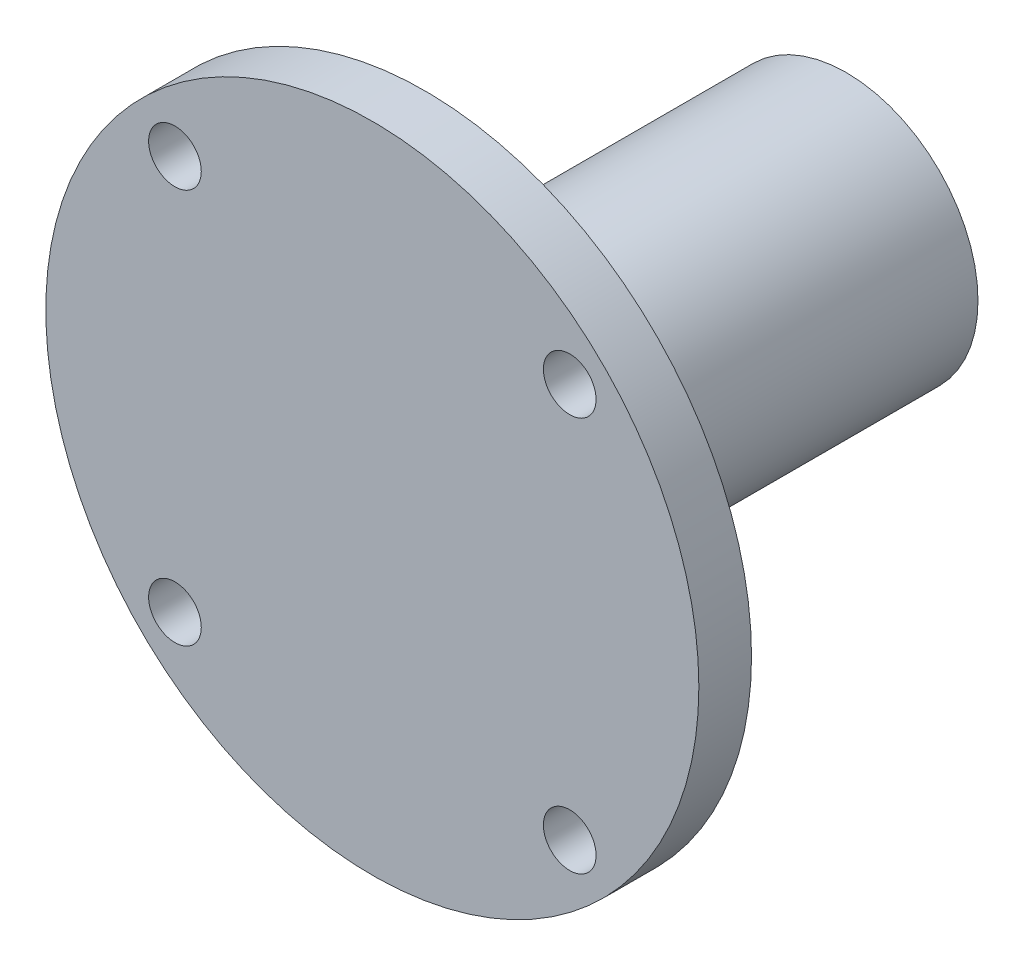
ISO-10303-21;
HEADER;
FILE_DESCRIPTION(('STEP AP214'),'2;1');
FILE_NAME('part.step','',(''),(''),'','','');
FILE_SCHEMA(('AUTOMOTIVE_DESIGN { 1 0 10303 214 1 1 1 1 }'));
ENDSEC;
DATA;
#1=APPLICATION_CONTEXT('core data for automotive mechanical design processes');
#2=APPLICATION_PROTOCOL_DEFINITION('international standard','automotive_design',2000,#1);
#3=PRODUCT_CONTEXT('',#1,'mechanical');
#4=PRODUCT('Part','Part','',(#3));
#5=PRODUCT_RELATED_PRODUCT_CATEGORY('part','',(#4));
#6=PRODUCT_DEFINITION_FORMATION('','',#4);
#7=PRODUCT_DEFINITION_CONTEXT('part definition',#1,'design');
#8=PRODUCT_DEFINITION('design','',#6,#7);
#9=PRODUCT_DEFINITION_SHAPE('','',#8);
#10=(LENGTH_UNIT() NAMED_UNIT(*) SI_UNIT(.MILLI.,.METRE.));
#11=(NAMED_UNIT(*) PLANE_ANGLE_UNIT() SI_UNIT($,.RADIAN.));
#12=(NAMED_UNIT(*) SI_UNIT($,.STERADIAN.) SOLID_ANGLE_UNIT());
#13=UNCERTAINTY_MEASURE_WITH_UNIT(LENGTH_MEASURE(1.E-05),#10,'distance_accuracy_value','');
#14=(GEOMETRIC_REPRESENTATION_CONTEXT(3) GLOBAL_UNCERTAINTY_ASSIGNED_CONTEXT((#13)) GLOBAL_UNIT_ASSIGNED_CONTEXT((#10,
#11,#12)) REPRESENTATION_CONTEXT('',''));
#15=CARTESIAN_POINT('',(0.,0.,0.));
#16=DIRECTION('',(0.,0.,1.));
#17=DIRECTION('',(1.,0.,0.));
#18=AXIS2_PLACEMENT_3D('',#15,#16,#17);
#19=CARTESIAN_POINT('',(0.,0.,0.));
#20=DIRECTION('',(0.,0.,1.));
#21=DIRECTION('',(1.,0.,0.));
#22=AXIS2_PLACEMENT_3D('',#19,#20,#21);
#23=PLANE('',#22);
#24=CARTESIAN_POINT('',(0.,0.,0.));
#25=DIRECTION('',(0.,0.,1.));
#26=DIRECTION('',(1.,0.,0.));
#27=AXIS2_PLACEMENT_3D('',#24,#25,#26);
#28=CIRCLE('',#27,12.5);
#29=CARTESIAN_POINT('',(12.5,0.,0.));
#30=VERTEX_POINT('',#29);
#31=EDGE_CURVE('E49',#30,#30,#28,.T.);
#32=ORIENTED_EDGE('',*,*,#31,.F.);
#33=EDGE_LOOP('',(#32));
#34=FACE_BOUND('',#33,.T.);
#35=CARTESIAN_POINT('',(0.,0.,0.));
#36=DIRECTION('',(0.,0.,1.));
#37=DIRECTION('',(1.,0.,0.));
#38=AXIS2_PLACEMENT_3D('',#35,#36,#37);
#39=CIRCLE('',#38,8.);
#40=CARTESIAN_POINT('',(8.,0.,0.));
#41=VERTEX_POINT('',#40);
#42=EDGE_CURVE('E55',#41,#41,#39,.T.);
#43=ORIENTED_EDGE('',*,*,#42,.T.);
#44=EDGE_LOOP('',(#43));
#45=FACE_BOUND('',#44,.T.);
#46=ADVANCED_FACE('F39',(#34,#45),#23,.F.);
#47=CARTESIAN_POINT('',(0.,0.,30.));
#48=DIRECTION('',(0.,0.,-1.));
#49=DIRECTION('',(-1.,0.,0.));
#50=AXIS2_PLACEMENT_3D('',#47,#48,#49);
#51=CYLINDRICAL_SURFACE('',#50,12.5);
#52=CARTESIAN_POINT('',(0.,0.,32.5000000000001));
#53=DIRECTION('',(0.,0.,1.));
#54=DIRECTION('',(1.,0.,0.));
#55=AXIS2_PLACEMENT_3D('',#52,#53,#54);
#56=CIRCLE('',#55,12.5);
#57=CARTESIAN_POINT('',(12.5,0.,32.5000000000001));
#58=VERTEX_POINT('',#57);
#59=EDGE_CURVE('E10',#58,#58,#56,.F.);
#60=ORIENTED_EDGE('',*,*,#59,.T.);
#61=EDGE_LOOP('',(#60));
#62=FACE_BOUND('',#61,.T.);
#63=ORIENTED_EDGE('',*,*,#31,.T.);
#64=EDGE_LOOP('',(#63));
#65=FACE_BOUND('',#64,.T.);
#66=ADVANCED_FACE('F113',(#62,#65),#51,.T.);
#67=CARTESIAN_POINT('',(0.,0.,30.));
#68=DIRECTION('',(0.,0.,-1.));
#69=DIRECTION('',(-1.,0.,0.));
#70=AXIS2_PLACEMENT_3D('',#67,#68,#69);
#71=CYLINDRICAL_SURFACE('',#70,8.);
#72=CARTESIAN_POINT('',(0.,0.,30.));
#73=DIRECTION('',(0.,0.,1.));
#74=DIRECTION('',(1.,0.,0.));
#75=AXIS2_PLACEMENT_3D('',#72,#73,#74);
#76=CIRCLE('',#75,8.);
#77=CARTESIAN_POINT('',(8.,0.,30.));
#78=VERTEX_POINT('',#77);
#79=EDGE_CURVE('E102',#78,#78,#76,.T.);
#80=ORIENTED_EDGE('',*,*,#79,.T.);
#81=EDGE_LOOP('',(#80));
#82=FACE_BOUND('',#81,.T.);
#83=ORIENTED_EDGE('',*,*,#42,.F.);
#84=EDGE_LOOP('',(#83));
#85=FACE_BOUND('',#84,.T.);
#86=ADVANCED_FACE('F110',(#82,#85),#71,.F.);
#87=CARTESIAN_POINT('',(0.,0.,30.));
#88=DIRECTION('',(0.,0.,1.));
#89=DIRECTION('',(1.,0.,0.));
#90=AXIS2_PLACEMENT_3D('',#87,#88,#89);
#91=PLANE('',#90);
#92=ORIENTED_EDGE('',*,*,#79,.F.);
#93=EDGE_LOOP('',(#92));
#94=FACE_BOUND('',#93,.T.);
#95=ADVANCED_FACE('F112',(#94),#91,.F.);
#96=CARTESIAN_POINT('',(0.,0.,45.));
#97=DIRECTION('',(0.,0.,-1.));
#98=DIRECTION('',(-1.,0.,0.));
#99=AXIS2_PLACEMENT_3D('',#96,#97,#98);
#100=CYLINDRICAL_SURFACE('',#99,31.);
#101=CARTESIAN_POINT('',(0.,0.,45.));
#102=DIRECTION('',(0.,0.,1.));
#103=DIRECTION('',(1.,0.,0.));
#104=AXIS2_PLACEMENT_3D('',#101,#102,#103);
#105=CIRCLE('',#104,31.);
#106=CARTESIAN_POINT('',(31.,0.,45.));
#107=VERTEX_POINT('',#106);
#108=EDGE_CURVE('E91',#107,#107,#105,.T.);
#109=ORIENTED_EDGE('',*,*,#108,.F.);
#110=EDGE_LOOP('',(#109));
#111=FACE_BOUND('',#110,.T.);
#112=CARTESIAN_POINT('',(0.,0.,40.));
#113=DIRECTION('',(0.,0.,1.));
#114=DIRECTION('',(1.,0.,0.));
#115=AXIS2_PLACEMENT_3D('',#112,#113,#114);
#116=CIRCLE('',#115,31.);
#117=CARTESIAN_POINT('',(31.,0.,40.));
#118=VERTEX_POINT('',#117);
#119=EDGE_CURVE('E90',#118,#118,#116,.T.);
#120=ORIENTED_EDGE('',*,*,#119,.T.);
#121=EDGE_LOOP('',(#120));
#122=FACE_BOUND('',#121,.T.);
#123=ADVANCED_FACE('F120',(#111,#122),#100,.T.);
#124=CARTESIAN_POINT('',(0.,0.,45.));
#125=DIRECTION('',(0.,0.,1.));
#126=DIRECTION('',(1.,0.,0.));
#127=AXIS2_PLACEMENT_3D('',#124,#125,#126);
#128=PLANE('',#127);
#129=CARTESIAN_POINT('',(-18.74,18.74,45.));
#130=DIRECTION('',(0.,0.,1.));
#131=DIRECTION('',(1.,0.,0.));
#132=AXIS2_PLACEMENT_3D('',#129,#130,#131);
#133=CIRCLE('',#132,2.5);
#134=CARTESIAN_POINT('',(-16.24,18.74,45.));
#135=VERTEX_POINT('',#134);
#136=EDGE_CURVE('E80',#135,#135,#133,.T.);
#137=ORIENTED_EDGE('',*,*,#136,.F.);
#138=EDGE_LOOP('',(#137));
#139=FACE_BOUND('',#138,.T.);
#140=CARTESIAN_POINT('',(18.74,18.74,45.));
#141=DIRECTION('',(0.,0.,1.));
#142=DIRECTION('',(1.,0.,0.));
#143=AXIS2_PLACEMENT_3D('',#140,#141,#142);
#144=CIRCLE('',#143,2.5);
#145=CARTESIAN_POINT('',(21.24,18.74,45.));
#146=VERTEX_POINT('',#145);
#147=EDGE_CURVE('E67',#146,#146,#144,.T.);
#148=ORIENTED_EDGE('',*,*,#147,.F.);
#149=EDGE_LOOP('',(#148));
#150=FACE_BOUND('',#149,.T.);
#151=CARTESIAN_POINT('',(18.74,-18.74,45.));
#152=DIRECTION('',(0.,0.,1.));
#153=DIRECTION('',(1.,0.,0.));
#154=AXIS2_PLACEMENT_3D('',#151,#152,#153);
#155=CIRCLE('',#154,2.5);
#156=CARTESIAN_POINT('',(21.24,-18.74,45.));
#157=VERTEX_POINT('',#156);
#158=EDGE_CURVE('E63',#157,#157,#155,.T.);
#159=ORIENTED_EDGE('',*,*,#158,.F.);
#160=EDGE_LOOP('',(#159));
#161=FACE_BOUND('',#160,.T.);
#162=CARTESIAN_POINT('',(-18.74,-18.74,45.));
#163=DIRECTION('',(0.,0.,1.));
#164=DIRECTION('',(1.,0.,0.));
#165=AXIS2_PLACEMENT_3D('',#162,#163,#164);
#166=CIRCLE('',#165,2.5);
#167=CARTESIAN_POINT('',(-16.24,-18.74,45.));
#168=VERTEX_POINT('',#167);
#169=EDGE_CURVE('E62',#168,#168,#166,.T.);
#170=ORIENTED_EDGE('',*,*,#169,.F.);
#171=EDGE_LOOP('',(#170));
#172=FACE_BOUND('',#171,.T.);
#173=ORIENTED_EDGE('',*,*,#108,.T.);
#174=EDGE_LOOP('',(#173));
#175=FACE_BOUND('',#174,.T.);
#176=ADVANCED_FACE('F159',(#139,#150,#161,#172,#175),#128,.T.);
#177=CARTESIAN_POINT('',(0.,0.,40.));
#178=DIRECTION('',(0.,0.,1.));
#179=DIRECTION('',(1.,0.,0.));
#180=AXIS2_PLACEMENT_3D('',#177,#178,#179);
#181=PLANE('',#180);
#182=CARTESIAN_POINT('',(-18.74,18.74,40.));
#183=DIRECTION('',(0.,0.,1.));
#184=DIRECTION('',(1.,0.,0.));
#185=AXIS2_PLACEMENT_3D('',#182,#183,#184);
#186=CIRCLE('',#185,2.49999999999999);
#187=CARTESIAN_POINT('',(-16.24,18.74,40.));
#188=VERTEX_POINT('',#187);
#189=EDGE_CURVE('E44',#188,#188,#186,.T.);
#190=ORIENTED_EDGE('',*,*,#189,.T.);
#191=EDGE_LOOP('',(#190));
#192=FACE_BOUND('',#191,.T.);
#193=CARTESIAN_POINT('',(18.74,18.74,40.));
#194=DIRECTION('',(0.,0.,1.));
#195=DIRECTION('',(1.,0.,0.));
#196=AXIS2_PLACEMENT_3D('',#193,#194,#195);
#197=CIRCLE('',#196,2.49999999999999);
#198=CARTESIAN_POINT('',(21.24,18.74,40.));
#199=VERTEX_POINT('',#198);
#200=EDGE_CURVE('E64',#199,#199,#197,.T.);
#201=ORIENTED_EDGE('',*,*,#200,.T.);
#202=EDGE_LOOP('',(#201));
#203=FACE_BOUND('',#202,.T.);
#204=CARTESIAN_POINT('',(18.74,-18.74,40.));
#205=DIRECTION('',(0.,0.,1.));
#206=DIRECTION('',(1.,0.,0.));
#207=AXIS2_PLACEMENT_3D('',#204,#205,#206);
#208=CIRCLE('',#207,2.49999999999999);
#209=CARTESIAN_POINT('',(21.24,-18.74,40.));
#210=VERTEX_POINT('',#209);
#211=EDGE_CURVE('E59',#210,#210,#208,.T.);
#212=ORIENTED_EDGE('',*,*,#211,.T.);
#213=EDGE_LOOP('',(#212));
#214=FACE_BOUND('',#213,.T.);
#215=CARTESIAN_POINT('',(-18.74,-18.74,40.));
#216=DIRECTION('',(0.,0.,1.));
#217=DIRECTION('',(1.,0.,0.));
#218=AXIS2_PLACEMENT_3D('',#215,#216,#217);
#219=CIRCLE('',#218,2.49999999999999);
#220=CARTESIAN_POINT('',(-16.24,-18.74,40.));
#221=VERTEX_POINT('',#220);
#222=EDGE_CURVE('E86',#221,#221,#219,.T.);
#223=ORIENTED_EDGE('',*,*,#222,.T.);
#224=EDGE_LOOP('',(#223));
#225=FACE_BOUND('',#224,.T.);
#226=CARTESIAN_POINT('',(0.,0.,40.));
#227=DIRECTION('',(0.,0.,1.));
#228=DIRECTION('',(1.,0.,0.));
#229=AXIS2_PLACEMENT_3D('',#226,#227,#228);
#230=CIRCLE('',#229,20.);
#231=CARTESIAN_POINT('',(20.,0.,40.));
#232=VERTEX_POINT('',#231);
#233=EDGE_CURVE('E95',#232,#232,#230,.T.);
#234=ORIENTED_EDGE('',*,*,#233,.T.);
#235=EDGE_LOOP('',(#234));
#236=FACE_BOUND('',#235,.T.);
#237=ORIENTED_EDGE('',*,*,#119,.F.);
#238=EDGE_LOOP('',(#237));
#239=FACE_BOUND('',#238,.T.);
#240=ADVANCED_FACE('F150',(#192,#203,#214,#225,#236,#239),#181,.F.);
#241=CARTESIAN_POINT('',(0.,0.,40.0000000000002));
#242=DIRECTION('',(0.,0.,1.));
#243=DIRECTION('',(1.,0.,0.));
#244=AXIS2_PLACEMENT_3D('',#241,#242,#243);
#245=CONICAL_SURFACE('',#244,20.,0.785398163397443);
#246=ORIENTED_EDGE('',*,*,#59,.F.);
#247=EDGE_LOOP('',(#246));
#248=FACE_BOUND('',#247,.T.);
#249=ORIENTED_EDGE('',*,*,#233,.F.);
#250=EDGE_LOOP('',(#249));
#251=FACE_BOUND('',#250,.T.);
#252=ADVANCED_FACE('F42',(#248,#251),#245,.T.);
#253=CARTESIAN_POINT('',(-18.74,-18.74,45.));
#254=DIRECTION('',(0.,0.,1.));
#255=DIRECTION('',(1.,0.,0.));
#256=AXIS2_PLACEMENT_3D('',#253,#254,#255);
#257=CYLINDRICAL_SURFACE('',#256,2.49999999999999);
#258=ORIENTED_EDGE('',*,*,#169,.T.);
#259=EDGE_LOOP('',(#258));
#260=FACE_BOUND('',#259,.T.);
#261=ORIENTED_EDGE('',*,*,#222,.F.);
#262=EDGE_LOOP('',(#261));
#263=FACE_BOUND('',#262,.T.);
#264=ADVANCED_FACE('F149',(#260,#263),#257,.F.);
#265=CARTESIAN_POINT('',(18.74,-18.74,45.));
#266=DIRECTION('',(0.,0.,1.));
#267=DIRECTION('',(1.,0.,0.));
#268=AXIS2_PLACEMENT_3D('',#265,#266,#267);
#269=CYLINDRICAL_SURFACE('',#268,2.49999999999999);
#270=ORIENTED_EDGE('',*,*,#158,.T.);
#271=EDGE_LOOP('',(#270));
#272=FACE_BOUND('',#271,.T.);
#273=ORIENTED_EDGE('',*,*,#211,.F.);
#274=EDGE_LOOP('',(#273));
#275=FACE_BOUND('',#274,.T.);
#276=ADVANCED_FACE('F178',(#272,#275),#269,.F.);
#277=CARTESIAN_POINT('',(18.74,18.74,45.));
#278=DIRECTION('',(0.,0.,1.));
#279=DIRECTION('',(1.,0.,0.));
#280=AXIS2_PLACEMENT_3D('',#277,#278,#279);
#281=CYLINDRICAL_SURFACE('',#280,2.49999999999999);
#282=ORIENTED_EDGE('',*,*,#147,.T.);
#283=EDGE_LOOP('',(#282));
#284=FACE_BOUND('',#283,.T.);
#285=ORIENTED_EDGE('',*,*,#200,.F.);
#286=EDGE_LOOP('',(#285));
#287=FACE_BOUND('',#286,.T.);
#288=ADVANCED_FACE('F188',(#284,#287),#281,.F.);
#289=CARTESIAN_POINT('',(-18.74,18.74,45.));
#290=DIRECTION('',(0.,0.,1.));
#291=DIRECTION('',(1.,0.,0.));
#292=AXIS2_PLACEMENT_3D('',#289,#290,#291);
#293=CYLINDRICAL_SURFACE('',#292,2.49999999999999);
#294=ORIENTED_EDGE('',*,*,#136,.T.);
#295=EDGE_LOOP('',(#294));
#296=FACE_BOUND('',#295,.T.);
#297=ORIENTED_EDGE('',*,*,#189,.F.);
#298=EDGE_LOOP('',(#297));
#299=FACE_BOUND('',#298,.T.);
#300=ADVANCED_FACE('F198',(#296,#299),#293,.F.);
#301=CLOSED_SHELL('',(#46,#66,#86,#95,#123,#176,#240,#252,#264,#276,#288,#300));
#302=MANIFOLD_SOLID_BREP('B2',#301);
#303=ADVANCED_BREP_SHAPE_REPRESENTATION('',(#18,#302),#14);
#304=SHAPE_DEFINITION_REPRESENTATION(#9,#303);
ENDSEC;
END-ISO-10303-21;
